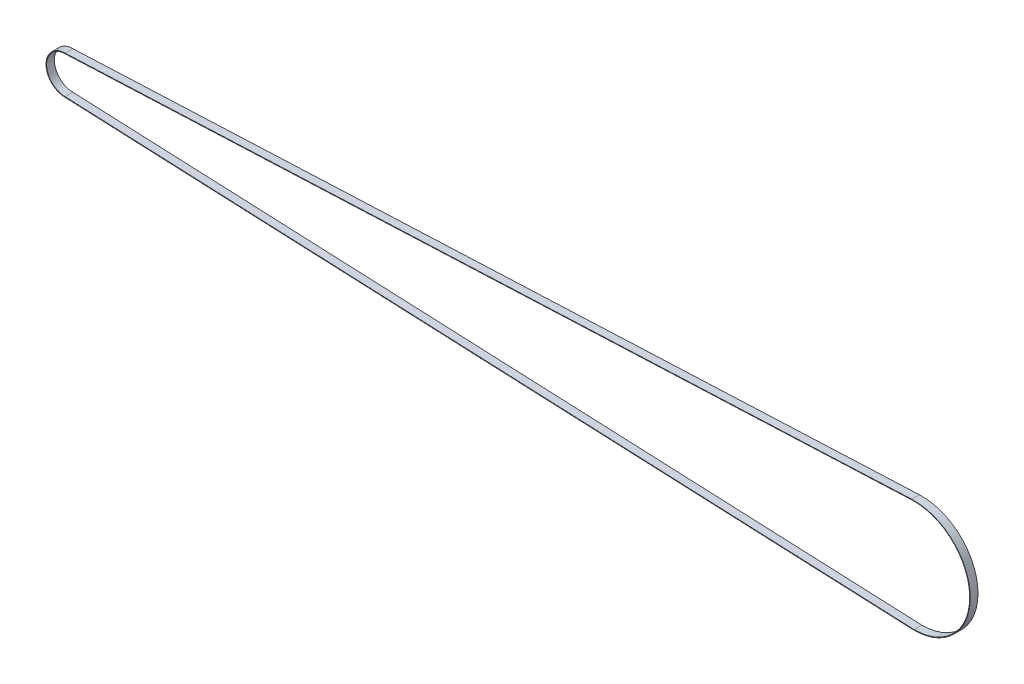
ISO-10303-21;
HEADER;
FILE_DESCRIPTION(('STEP AP214'),'2;1');
FILE_NAME('part.step','',(''),(''),'','','');
FILE_SCHEMA(('AUTOMOTIVE_DESIGN { 1 0 10303 214 1 1 1 1 }'));
ENDSEC;
DATA;
#1=APPLICATION_CONTEXT('core data for automotive mechanical design processes');
#2=APPLICATION_PROTOCOL_DEFINITION('international standard','automotive_design',2000,#1);
#3=PRODUCT_CONTEXT('',#1,'mechanical');
#4=PRODUCT('Part','Part','',(#3));
#5=PRODUCT_RELATED_PRODUCT_CATEGORY('part','',(#4));
#6=PRODUCT_DEFINITION_FORMATION('','',#4);
#7=PRODUCT_DEFINITION_CONTEXT('part definition',#1,'design');
#8=PRODUCT_DEFINITION('design','',#6,#7);
#9=PRODUCT_DEFINITION_SHAPE('','',#8);
#10=(LENGTH_UNIT() NAMED_UNIT(*) SI_UNIT(.MILLI.,.METRE.));
#11=(NAMED_UNIT(*) PLANE_ANGLE_UNIT() SI_UNIT($,.RADIAN.));
#12=(NAMED_UNIT(*) SI_UNIT($,.STERADIAN.) SOLID_ANGLE_UNIT());
#13=UNCERTAINTY_MEASURE_WITH_UNIT(LENGTH_MEASURE(1.E-05),#10,'distance_accuracy_value','');
#14=(GEOMETRIC_REPRESENTATION_CONTEXT(3) GLOBAL_UNCERTAINTY_ASSIGNED_CONTEXT((#13)) GLOBAL_UNIT_ASSIGNED_CONTEXT((#10,
#11,#12)) REPRESENTATION_CONTEXT('',''));
#15=CARTESIAN_POINT('',(0.,0.,0.));
#16=DIRECTION('',(0.,0.,1.));
#17=DIRECTION('',(1.,0.,0.));
#18=AXIS2_PLACEMENT_3D('',#15,#16,#17);
#19=CARTESIAN_POINT('',(-1396.238,0.,12.7));
#20=DIRECTION('',(0.,0.,-1.));
#21=DIRECTION('',(-1.,0.,0.));
#22=AXIS2_PLACEMENT_3D('',#19,#20,#21);
#23=PLANE('',#22);
#24=CARTESIAN_POINT('',(-1396.238,0.,12.7));
#25=DIRECTION('',(0.,0.,1.));
#26=DIRECTION('',(-1.,0.,0.));
#27=AXIS2_PLACEMENT_3D('',#24,#25,#26);
#28=CIRCLE('',#27,31.4969678942399);
#29=CARTESIAN_POINT('',(-1396.238,31.4969678942399,12.7));
#30=VERTEX_POINT('',#29);
#31=CARTESIAN_POINT('',(-1396.238,-31.4969678942399,12.7));
#32=VERTEX_POINT('',#31);
#33=EDGE_CURVE('E134',#30,#32,#28,.T.);
#34=ORIENTED_EDGE('',*,*,#33,.T.);
#35=DIRECTION('',(0.999048254870778,-0.0436186249170432,0.));
#36=VECTOR('',#35,1.);
#37=CARTESIAN_POINT('',(-1396.238,-31.4969678942399,12.7));
#38=LINE('',#37,#36);
#39=CARTESIAN_POINT('',(-4.02900756219553,-92.2810607057868,12.7));
#40=VERTEX_POINT('',#39);
#41=EDGE_CURVE('E137',#32,#40,#38,.T.);
#42=ORIENTED_EDGE('',*,*,#41,.T.);
#43=CARTESIAN_POINT('',(0.,0.,12.7));
#44=DIRECTION('',(0.,0.,1.));
#45=DIRECTION('',(-1.,0.,0.));
#46=AXIS2_PLACEMENT_3D('',#43,#44,#45);
#47=CIRCLE('',#46,92.3689724253839);
#48=CARTESIAN_POINT('',(-4.02900756219553,92.2810607057868,12.7));
#49=VERTEX_POINT('',#48);
#50=EDGE_CURVE('E140',#40,#49,#47,.T.);
#51=ORIENTED_EDGE('',*,*,#50,.T.);
#52=DIRECTION('',(-0.999048254870778,-0.0436186249170432,0.));
#53=VECTOR('',#52,1.);
#54=CARTESIAN_POINT('',(-1396.238,31.4969678942399,12.7));
#55=LINE('',#54,#53);
#56=EDGE_CURVE('E142',#49,#30,#55,.T.);
#57=ORIENTED_EDGE('',*,*,#56,.T.);
#58=EDGE_LOOP('',(#34,#42,#51,#57));
#59=FACE_BOUND('',#58,.T.);
#60=CARTESIAN_POINT('',(0.,0.,12.7));
#61=DIRECTION('',(0.,0.,1.));
#62=DIRECTION('',(-1.,0.,0.));
#63=AXIS2_PLACEMENT_3D('',#60,#61,#62);
#64=CIRCLE('',#63,91.44);
#65=CARTESIAN_POINT('',(0.,-91.44,12.7));
#66=VERTEX_POINT('',#65);
#67=CARTESIAN_POINT('',(-3.99419196281734,91.3527231699426,12.7));
#68=VERTEX_POINT('',#67);
#69=EDGE_CURVE('E98',#66,#68,#64,.T.);
#70=ORIENTED_EDGE('',*,*,#69,.F.);
#71=DIRECTION('',(0.999048254870778,-0.0436186249170432,0.));
#72=VECTOR('',#71,1.);
#73=CARTESIAN_POINT('',(-1396.238,-30.48,12.7));
#74=LINE('',#73,#72);
#75=CARTESIAN_POINT('',(-1396.238,-30.48,12.7));
#76=VERTEX_POINT('',#75);
#77=EDGE_CURVE('E120',#76,#66,#74,.T.);
#78=ORIENTED_EDGE('',*,*,#77,.F.);
#79=CARTESIAN_POINT('',(-1396.238,0.,12.7));
#80=DIRECTION('',(0.,0.,1.));
#81=DIRECTION('',(1.,0.,0.));
#82=AXIS2_PLACEMENT_3D('',#79,#80,#81);
#83=CIRCLE('',#82,30.48);
#84=CARTESIAN_POINT('',(-1396.238,30.48,12.7));
#85=VERTEX_POINT('',#84);
#86=EDGE_CURVE('E118',#85,#76,#83,.T.);
#87=ORIENTED_EDGE('',*,*,#86,.F.);
#88=DIRECTION('',(-0.999045528980125,-0.0436810144665063,0.));
#89=VECTOR('',#88,1.);
#90=CARTESIAN_POINT('',(-3.99419196281734,91.3527231699426,12.7));
#91=LINE('',#90,#89);
#92=EDGE_CURVE('E106',#68,#85,#91,.T.);
#93=ORIENTED_EDGE('',*,*,#92,.F.);
#94=EDGE_LOOP('',(#70,#78,#87,#93));
#95=FACE_BOUND('',#94,.T.);
#96=ADVANCED_FACE('F33',(#59,#95),#23,.F.);
#97=CARTESIAN_POINT('',(-1396.238,0.,0.));
#98=DIRECTION('',(0.,0.,-1.));
#99=DIRECTION('',(-1.,0.,0.));
#100=AXIS2_PLACEMENT_3D('',#97,#98,#99);
#101=PLANE('',#100);
#102=CARTESIAN_POINT('',(-1396.238,0.,0.));
#103=DIRECTION('',(0.,0.,1.));
#104=DIRECTION('',(-1.,0.,0.));
#105=AXIS2_PLACEMENT_3D('',#102,#103,#104);
#106=CIRCLE('',#105,31.4969678942399);
#107=CARTESIAN_POINT('',(-1396.238,31.4969678942399,0.));
#108=VERTEX_POINT('',#107);
#109=CARTESIAN_POINT('',(-1396.238,-31.4969678942399,0.));
#110=VERTEX_POINT('',#109);
#111=EDGE_CURVE('E114',#108,#110,#106,.T.);
#112=ORIENTED_EDGE('',*,*,#111,.F.);
#113=DIRECTION('',(-0.999048254870778,-0.0436186249170432,0.));
#114=VECTOR('',#113,1.);
#115=CARTESIAN_POINT('',(-1396.238,31.4969678942399,0.));
#116=LINE('',#115,#114);
#117=CARTESIAN_POINT('',(-4.02900756219553,92.2810607057868,0.));
#118=VERTEX_POINT('',#117);
#119=EDGE_CURVE('E138',#118,#108,#116,.T.);
#120=ORIENTED_EDGE('',*,*,#119,.F.);
#121=CARTESIAN_POINT('',(0.,0.,0.));
#122=DIRECTION('',(0.,0.,1.));
#123=DIRECTION('',(-1.,0.,0.));
#124=AXIS2_PLACEMENT_3D('',#121,#122,#123);
#125=CIRCLE('',#124,92.3689724253839);
#126=CARTESIAN_POINT('',(-4.02900756219553,-92.2810607057868,0.));
#127=VERTEX_POINT('',#126);
#128=EDGE_CURVE('E149',#127,#118,#125,.T.);
#129=ORIENTED_EDGE('',*,*,#128,.F.);
#130=DIRECTION('',(0.999048254870778,-0.0436186249170432,0.));
#131=VECTOR('',#130,1.);
#132=CARTESIAN_POINT('',(-1396.238,-31.4969678942399,0.));
#133=LINE('',#132,#131);
#134=EDGE_CURVE('E147',#110,#127,#133,.T.);
#135=ORIENTED_EDGE('',*,*,#134,.F.);
#136=EDGE_LOOP('',(#112,#120,#129,#135));
#137=FACE_BOUND('',#136,.T.);
#138=DIRECTION('',(0.999048254870778,-0.0436186249170432,0.));
#139=VECTOR('',#138,1.);
#140=CARTESIAN_POINT('',(-1396.238,-30.48,0.));
#141=LINE('',#140,#139);
#142=CARTESIAN_POINT('',(-1396.238,-30.48,0.));
#143=VERTEX_POINT('',#142);
#144=CARTESIAN_POINT('',(0.,-91.44,0.));
#145=VERTEX_POINT('',#144);
#146=EDGE_CURVE('E107',#143,#145,#141,.T.);
#147=ORIENTED_EDGE('',*,*,#146,.T.);
#148=CARTESIAN_POINT('',(0.,0.,0.));
#149=DIRECTION('',(0.,0.,1.));
#150=DIRECTION('',(-1.,0.,0.));
#151=AXIS2_PLACEMENT_3D('',#148,#149,#150);
#152=CIRCLE('',#151,91.44);
#153=CARTESIAN_POINT('',(-3.99419196281734,91.3527231699426,0.));
#154=VERTEX_POINT('',#153);
#155=EDGE_CURVE('E56',#145,#154,#152,.T.);
#156=ORIENTED_EDGE('',*,*,#155,.T.);
#157=DIRECTION('',(-0.999045528980125,-0.0436810144665063,0.));
#158=VECTOR('',#157,1.);
#159=CARTESIAN_POINT('',(-3.99419196281734,91.3527231699426,0.));
#160=LINE('',#159,#158);
#161=CARTESIAN_POINT('',(-1396.238,30.48,0.));
#162=VERTEX_POINT('',#161);
#163=EDGE_CURVE('E113',#154,#162,#160,.T.);
#164=ORIENTED_EDGE('',*,*,#163,.T.);
#165=CARTESIAN_POINT('',(-1396.238,0.,0.));
#166=DIRECTION('',(0.,0.,1.));
#167=DIRECTION('',(1.,0.,0.));
#168=AXIS2_PLACEMENT_3D('',#165,#166,#167);
#169=CIRCLE('',#168,30.48);
#170=EDGE_CURVE('E126',#162,#143,#169,.T.);
#171=ORIENTED_EDGE('',*,*,#170,.T.);
#172=EDGE_LOOP('',(#147,#156,#164,#171));
#173=FACE_BOUND('',#172,.T.);
#174=ADVANCED_FACE('F167',(#137,#173),#101,.T.);
#175=CARTESIAN_POINT('',(-1396.238,0.,12.7));
#176=DIRECTION('',(0.,0.,-1.));
#177=DIRECTION('',(-1.,0.,0.));
#178=AXIS2_PLACEMENT_3D('',#175,#176,#177);
#179=CYLINDRICAL_SURFACE('',#178,31.4969678942399);
#180=ORIENTED_EDGE('',*,*,#111,.T.);
#181=DIRECTION('',(0.,0.,-1.));
#182=VECTOR('',#181,1.);
#183=CARTESIAN_POINT('',(-1396.238,-31.4969678942399,12.7));
#184=LINE('',#183,#182);
#185=EDGE_CURVE('E11',#32,#110,#184,.T.);
#186=ORIENTED_EDGE('',*,*,#185,.F.);
#187=ORIENTED_EDGE('',*,*,#33,.F.);
#188=DIRECTION('',(0.,0.,-1.));
#189=VECTOR('',#188,1.);
#190=CARTESIAN_POINT('',(-1396.238,31.4969678942399,12.7));
#191=LINE('',#190,#189);
#192=EDGE_CURVE('E144',#30,#108,#191,.T.);
#193=ORIENTED_EDGE('',*,*,#192,.T.);
#194=EDGE_LOOP('',(#180,#186,#187,#193));
#195=FACE_BOUND('',#194,.T.);
#196=ADVANCED_FACE('F35',(#195),#179,.T.);
#197=CARTESIAN_POINT('',(-1396.238,-31.4969678942399,12.7));
#198=DIRECTION('',(0.0436186249170432,0.999048254870778,0.));
#199=DIRECTION('',(-0.999048254870778,0.0436186249170432,0.));
#200=AXIS2_PLACEMENT_3D('',#197,#198,#199);
#201=PLANE('',#200);
#202=ORIENTED_EDGE('',*,*,#134,.T.);
#203=DIRECTION('',(0.,0.,-1.));
#204=VECTOR('',#203,1.);
#205=CARTESIAN_POINT('',(-4.02900756219553,-92.2810607057868,12.7));
#206=LINE('',#205,#204);
#207=EDGE_CURVE('E41',#40,#127,#206,.T.);
#208=ORIENTED_EDGE('',*,*,#207,.F.);
#209=ORIENTED_EDGE('',*,*,#41,.F.);
#210=ORIENTED_EDGE('',*,*,#185,.T.);
#211=EDGE_LOOP('',(#202,#208,#209,#210));
#212=FACE_BOUND('',#211,.T.);
#213=ADVANCED_FACE('F177',(#212),#201,.F.);
#214=CARTESIAN_POINT('',(0.,0.,12.7));
#215=DIRECTION('',(0.,0.,-1.));
#216=DIRECTION('',(-1.,0.,0.));
#217=AXIS2_PLACEMENT_3D('',#214,#215,#216);
#218=CYLINDRICAL_SURFACE('',#217,92.3689724253839);
#219=ORIENTED_EDGE('',*,*,#128,.T.);
#220=DIRECTION('',(0.,0.,-1.));
#221=VECTOR('',#220,1.);
#222=CARTESIAN_POINT('',(-4.02900756219553,92.2810607057868,12.7));
#223=LINE('',#222,#221);
#224=EDGE_CURVE('E154',#49,#118,#223,.T.);
#225=ORIENTED_EDGE('',*,*,#224,.F.);
#226=ORIENTED_EDGE('',*,*,#50,.F.);
#227=ORIENTED_EDGE('',*,*,#207,.T.);
#228=EDGE_LOOP('',(#219,#225,#226,#227));
#229=FACE_BOUND('',#228,.T.);
#230=ADVANCED_FACE('F161',(#229),#218,.T.);
#231=CARTESIAN_POINT('',(-1396.238,31.4969678942399,12.7));
#232=DIRECTION('',(0.0436186249170432,-0.999048254870778,0.));
#233=DIRECTION('',(0.999048254870778,0.0436186249170432,0.));
#234=AXIS2_PLACEMENT_3D('',#231,#232,#233);
#235=PLANE('',#234);
#236=ORIENTED_EDGE('',*,*,#119,.T.);
#237=ORIENTED_EDGE('',*,*,#192,.F.);
#238=ORIENTED_EDGE('',*,*,#56,.F.);
#239=ORIENTED_EDGE('',*,*,#224,.T.);
#240=EDGE_LOOP('',(#236,#237,#238,#239));
#241=FACE_BOUND('',#240,.T.);
#242=ADVANCED_FACE('F171',(#241),#235,.F.);
#243=CARTESIAN_POINT('',(0.,0.,12.7));
#244=DIRECTION('',(0.,0.,-1.));
#245=DIRECTION('',(-1.,0.,0.));
#246=AXIS2_PLACEMENT_3D('',#243,#244,#245);
#247=CYLINDRICAL_SURFACE('',#246,91.44);
#248=ORIENTED_EDGE('',*,*,#155,.F.);
#249=DIRECTION('',(0.,0.,-1.));
#250=VECTOR('',#249,1.);
#251=CARTESIAN_POINT('',(0.,-91.44,12.7));
#252=LINE('',#251,#250);
#253=EDGE_CURVE('E102',#66,#145,#252,.T.);
#254=ORIENTED_EDGE('',*,*,#253,.F.);
#255=ORIENTED_EDGE('',*,*,#69,.T.);
#256=DIRECTION('',(0.,0.,-1.));
#257=VECTOR('',#256,1.);
#258=CARTESIAN_POINT('',(-3.99419196281734,91.3527231699426,12.7));
#259=LINE('',#258,#257);
#260=EDGE_CURVE('E101',#68,#154,#259,.T.);
#261=ORIENTED_EDGE('',*,*,#260,.T.);
#262=EDGE_LOOP('',(#248,#254,#255,#261));
#263=FACE_BOUND('',#262,.T.);
#264=ADVANCED_FACE('F100',(#263),#247,.F.);
#265=CARTESIAN_POINT('',(-3.99419196281734,91.3527231699426,12.7));
#266=DIRECTION('',(0.0436810144665063,-0.999045528980125,0.));
#267=DIRECTION('',(0.999045528980125,0.0436810144665063,0.));
#268=AXIS2_PLACEMENT_3D('',#265,#266,#267);
#269=PLANE('',#268);
#270=ORIENTED_EDGE('',*,*,#163,.F.);
#271=ORIENTED_EDGE('',*,*,#260,.F.);
#272=ORIENTED_EDGE('',*,*,#92,.T.);
#273=DIRECTION('',(0.,0.,-1.));
#274=VECTOR('',#273,1.);
#275=CARTESIAN_POINT('',(-1396.238,30.48,12.7));
#276=LINE('',#275,#274);
#277=EDGE_CURVE('E115',#85,#162,#276,.T.);
#278=ORIENTED_EDGE('',*,*,#277,.T.);
#279=EDGE_LOOP('',(#270,#271,#272,#278));
#280=FACE_BOUND('',#279,.T.);
#281=ADVANCED_FACE('F110',(#280),#269,.T.);
#282=CARTESIAN_POINT('',(-1396.238,0.,12.7));
#283=DIRECTION('',(0.,0.,-1.));
#284=DIRECTION('',(-1.,0.,0.));
#285=AXIS2_PLACEMENT_3D('',#282,#283,#284);
#286=CYLINDRICAL_SURFACE('',#285,30.48);
#287=ORIENTED_EDGE('',*,*,#170,.F.);
#288=ORIENTED_EDGE('',*,*,#277,.F.);
#289=ORIENTED_EDGE('',*,*,#86,.T.);
#290=DIRECTION('',(0.,0.,-1.));
#291=VECTOR('',#290,1.);
#292=CARTESIAN_POINT('',(-1396.238,-30.48,12.7));
#293=LINE('',#292,#291);
#294=EDGE_CURVE('E48',#76,#143,#293,.T.);
#295=ORIENTED_EDGE('',*,*,#294,.T.);
#296=EDGE_LOOP('',(#287,#288,#289,#295));
#297=FACE_BOUND('',#296,.T.);
#298=ADVANCED_FACE('F200',(#297),#286,.F.);
#299=CARTESIAN_POINT('',(-1396.238,-30.48,12.7));
#300=DIRECTION('',(0.0436186249170432,0.999048254870778,0.));
#301=DIRECTION('',(-0.999048254870778,0.0436186249170432,0.));
#302=AXIS2_PLACEMENT_3D('',#299,#300,#301);
#303=PLANE('',#302);
#304=ORIENTED_EDGE('',*,*,#146,.F.);
#305=ORIENTED_EDGE('',*,*,#294,.F.);
#306=ORIENTED_EDGE('',*,*,#77,.T.);
#307=ORIENTED_EDGE('',*,*,#253,.T.);
#308=EDGE_LOOP('',(#304,#305,#306,#307));
#309=FACE_BOUND('',#308,.T.);
#310=ADVANCED_FACE('F204',(#309),#303,.T.);
#311=CLOSED_SHELL('',(#96,#174,#196,#213,#230,#242,#264,#281,#298,#310));
#312=MANIFOLD_SOLID_BREP('B2',#311);
#313=ADVANCED_BREP_SHAPE_REPRESENTATION('',(#18,#312),#14);
#314=SHAPE_DEFINITION_REPRESENTATION(#9,#313);
ENDSEC;
END-ISO-10303-21;
